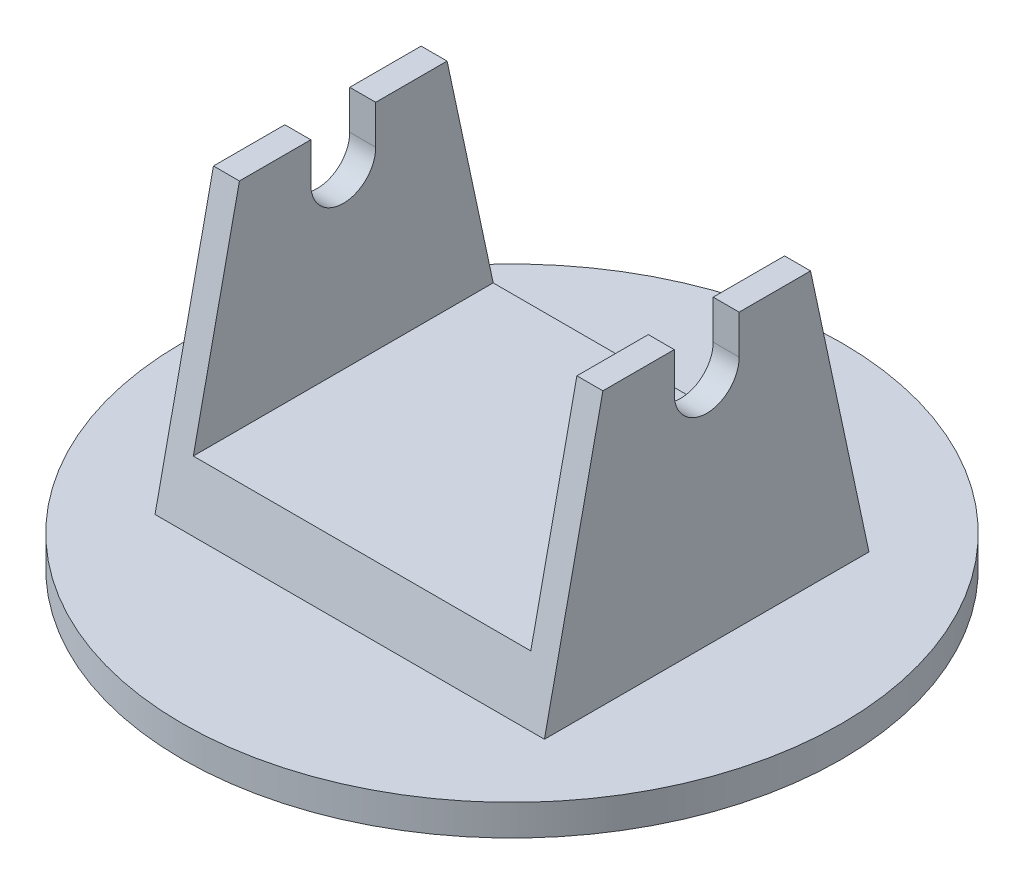
ISO-10303-21;
HEADER;
FILE_DESCRIPTION(('STEP AP214'),'2;1');
FILE_NAME('part.step','',(''),(''),'','','');
FILE_SCHEMA(('AUTOMOTIVE_DESIGN { 1 0 10303 214 1 1 1 1 }'));
ENDSEC;
DATA;
#1=APPLICATION_CONTEXT('core data for automotive mechanical design processes');
#2=APPLICATION_PROTOCOL_DEFINITION('international standard','automotive_design',2000,#1);
#3=PRODUCT_CONTEXT('',#1,'mechanical');
#4=PRODUCT('Part','Part','',(#3));
#5=PRODUCT_RELATED_PRODUCT_CATEGORY('part','',(#4));
#6=PRODUCT_DEFINITION_FORMATION('','',#4);
#7=PRODUCT_DEFINITION_CONTEXT('part definition',#1,'design');
#8=PRODUCT_DEFINITION('design','',#6,#7);
#9=PRODUCT_DEFINITION_SHAPE('','',#8);
#10=(LENGTH_UNIT() NAMED_UNIT(*) SI_UNIT(.MILLI.,.METRE.));
#11=(NAMED_UNIT(*) PLANE_ANGLE_UNIT() SI_UNIT($,.RADIAN.));
#12=(NAMED_UNIT(*) SI_UNIT($,.STERADIAN.) SOLID_ANGLE_UNIT());
#13=UNCERTAINTY_MEASURE_WITH_UNIT(LENGTH_MEASURE(1.E-05),#10,'distance_accuracy_value','');
#14=(GEOMETRIC_REPRESENTATION_CONTEXT(3) GLOBAL_UNCERTAINTY_ASSIGNED_CONTEXT((#13)) GLOBAL_UNIT_ASSIGNED_CONTEXT((#10,
#11,#12)) REPRESENTATION_CONTEXT('',''));
#15=CARTESIAN_POINT('',(0.,0.,0.));
#16=DIRECTION('',(0.,0.,1.));
#17=DIRECTION('',(1.,0.,0.));
#18=AXIS2_PLACEMENT_3D('',#15,#16,#17);
#19=CARTESIAN_POINT('',(30.,84.025,-16.));
#20=DIRECTION('',(0.,-1.,0.));
#21=DIRECTION('',(0.,0.,-1.));
#22=AXIS2_PLACEMENT_3D('',#19,#20,#21);
#23=PLANE('',#22);
#24=DIRECTION('',(1.,0.,0.));
#25=VECTOR('',#24,1.);
#26=CARTESIAN_POINT('',(-50.8,84.025,5.));
#27=LINE('',#26,#25);
#28=CARTESIAN_POINT('',(26.,84.025,5.));
#29=VERTEX_POINT('',#28);
#30=CARTESIAN_POINT('',(30.,84.025,5.));
#31=VERTEX_POINT('',#30);
#32=EDGE_CURVE('E280',#29,#31,#27,.T.);
#33=ORIENTED_EDGE('',*,*,#32,.F.);
#34=DIRECTION('',(0.,0.,1.));
#35=VECTOR('',#34,1.);
#36=CARTESIAN_POINT('',(26.,84.025,-50.8));
#37=LINE('',#36,#35);
#38=CARTESIAN_POINT('',(26.,84.025,16.));
#39=VERTEX_POINT('',#38);
#40=EDGE_CURVE('E292',#29,#39,#37,.T.);
#41=ORIENTED_EDGE('',*,*,#40,.T.);
#42=DIRECTION('',(-1.,0.,0.));
#43=VECTOR('',#42,1.);
#44=CARTESIAN_POINT('',(30.,84.025,16.));
#45=LINE('',#44,#43);
#46=CARTESIAN_POINT('',(30.,84.025,16.));
#47=VERTEX_POINT('',#46);
#48=EDGE_CURVE('E165',#47,#39,#45,.T.);
#49=ORIENTED_EDGE('',*,*,#48,.F.);
#50=DIRECTION('',(0.,0.,1.));
#51=VECTOR('',#50,1.);
#52=CARTESIAN_POINT('',(30.,84.025,-16.));
#53=LINE('',#52,#51);
#54=EDGE_CURVE('E229',#31,#47,#53,.T.);
#55=ORIENTED_EDGE('',*,*,#54,.F.);
#56=EDGE_LOOP('',(#33,#41,#49,#55));
#57=FACE_BOUND('',#56,.T.);
#58=ADVANCED_FACE('F32',(#57),#23,.F.);
#59=DIRECTION('',(-1.,0.,0.));
#60=VECTOR('',#59,1.);
#61=CARTESIAN_POINT('',(30.,84.025,-16.));
#62=LINE('',#61,#60);
#63=CARTESIAN_POINT('',(30.,84.025,-16.));
#64=VERTEX_POINT('',#63);
#65=CARTESIAN_POINT('',(26.,84.025,-16.));
#66=VERTEX_POINT('',#65);
#67=EDGE_CURVE('E164',#64,#66,#62,.T.);
#68=ORIENTED_EDGE('',*,*,#67,.T.);
#69=CARTESIAN_POINT('',(26.,84.025,-5.));
#70=VERTEX_POINT('',#69);
#71=EDGE_CURVE('E308',#66,#70,#37,.T.);
#72=ORIENTED_EDGE('',*,*,#71,.T.);
#73=DIRECTION('',(1.,0.,0.));
#74=VECTOR('',#73,1.);
#75=CARTESIAN_POINT('',(-50.8,84.025,-5.));
#76=LINE('',#75,#74);
#77=CARTESIAN_POINT('',(30.,84.025,-5.));
#78=VERTEX_POINT('',#77);
#79=EDGE_CURVE('E201',#70,#78,#76,.T.);
#80=ORIENTED_EDGE('',*,*,#79,.T.);
#81=EDGE_CURVE('E230',#64,#78,#53,.T.);
#82=ORIENTED_EDGE('',*,*,#81,.F.);
#83=EDGE_LOOP('',(#68,#72,#80,#82));
#84=FACE_BOUND('',#83,.T.);
#85=ADVANCED_FACE('F272',(#84),#23,.F.);
#86=CARTESIAN_POINT('',(-50.8,78.025,0.));
#87=DIRECTION('',(1.,0.,0.));
#88=DIRECTION('',(0.,0.,-1.));
#89=AXIS2_PLACEMENT_3D('',#86,#87,#88);
#90=CYLINDRICAL_SURFACE('',#89,5.);
#91=DIRECTION('',(1.,0.,0.));
#92=VECTOR('',#91,1.);
#93=CARTESIAN_POINT('',(-50.8,78.025,-5.));
#94=LINE('',#93,#92);
#95=CARTESIAN_POINT('',(26.,78.025,-5.));
#96=VERTEX_POINT('',#95);
#97=CARTESIAN_POINT('',(30.,78.025,-5.));
#98=VERTEX_POINT('',#97);
#99=EDGE_CURVE('E199',#96,#98,#94,.T.);
#100=ORIENTED_EDGE('',*,*,#99,.F.);
#101=CARTESIAN_POINT('',(26.,78.025,0.));
#102=DIRECTION('',(1.,0.,0.));
#103=DIRECTION('',(0.,0.,-1.));
#104=AXIS2_PLACEMENT_3D('',#101,#102,#103);
#105=CIRCLE('',#104,5.);
#106=CARTESIAN_POINT('',(26.,78.025,5.));
#107=VERTEX_POINT('',#106);
#108=EDGE_CURVE('E207',#96,#107,#105,.F.);
#109=ORIENTED_EDGE('',*,*,#108,.T.);
#110=DIRECTION('',(1.,0.,0.));
#111=VECTOR('',#110,1.);
#112=CARTESIAN_POINT('',(-50.8,78.025,5.));
#113=LINE('',#112,#111);
#114=CARTESIAN_POINT('',(30.,78.025,5.));
#115=VERTEX_POINT('',#114);
#116=EDGE_CURVE('E279',#107,#115,#113,.T.);
#117=ORIENTED_EDGE('',*,*,#116,.T.);
#118=CARTESIAN_POINT('',(30.,78.025,0.));
#119=DIRECTION('',(1.,0.,0.));
#120=DIRECTION('',(0.,0.,-1.));
#121=AXIS2_PLACEMENT_3D('',#118,#119,#120);
#122=CIRCLE('',#121,5.);
#123=EDGE_CURVE('E210',#115,#98,#122,.T.);
#124=ORIENTED_EDGE('',*,*,#123,.T.);
#125=EDGE_LOOP('',(#100,#109,#117,#124));
#126=FACE_BOUND('',#125,.T.);
#127=ADVANCED_FACE('F206',(#126),#90,.F.);
#128=CARTESIAN_POINT('',(-50.8,78.025,5.));
#129=DIRECTION('',(0.,0.,1.));
#130=DIRECTION('',(0.,-1.,0.));
#131=AXIS2_PLACEMENT_3D('',#128,#129,#130);
#132=PLANE('',#131);
#133=ORIENTED_EDGE('',*,*,#116,.F.);
#134=DIRECTION('',(0.,1.,0.));
#135=VECTOR('',#134,1.);
#136=CARTESIAN_POINT('',(26.,78.025,5.));
#137=LINE('',#136,#135);
#138=EDGE_CURVE('E287',#107,#29,#137,.T.);
#139=ORIENTED_EDGE('',*,*,#138,.T.);
#140=ORIENTED_EDGE('',*,*,#32,.T.);
#141=DIRECTION('',(0.,-1.,0.));
#142=VECTOR('',#141,1.);
#143=CARTESIAN_POINT('',(30.,78.025,5.));
#144=LINE('',#143,#142);
#145=EDGE_CURVE('E213',#31,#115,#144,.T.);
#146=ORIENTED_EDGE('',*,*,#145,.T.);
#147=EDGE_LOOP('',(#133,#139,#140,#146));
#148=FACE_BOUND('',#147,.T.);
#149=ADVANCED_FACE('F286',(#148),#132,.F.);
#150=CARTESIAN_POINT('',(-50.8,78.025,-5.));
#151=DIRECTION('',(0.,0.,-1.));
#152=DIRECTION('',(0.,1.,0.));
#153=AXIS2_PLACEMENT_3D('',#150,#151,#152);
#154=PLANE('',#153);
#155=ORIENTED_EDGE('',*,*,#79,.F.);
#156=DIRECTION('',(0.,-1.,0.));
#157=VECTOR('',#156,1.);
#158=CARTESIAN_POINT('',(26.,78.025,-5.));
#159=LINE('',#158,#157);
#160=EDGE_CURVE('E40',#70,#96,#159,.T.);
#161=ORIENTED_EDGE('',*,*,#160,.T.);
#162=ORIENTED_EDGE('',*,*,#99,.T.);
#163=DIRECTION('',(0.,1.,0.));
#164=VECTOR('',#163,1.);
#165=CARTESIAN_POINT('',(30.,78.025,-5.));
#166=LINE('',#165,#164);
#167=EDGE_CURVE('E217',#98,#78,#166,.T.);
#168=ORIENTED_EDGE('',*,*,#167,.T.);
#169=EDGE_LOOP('',(#155,#161,#162,#168));
#170=FACE_BOUND('',#169,.T.);
#171=ADVANCED_FACE('F197',(#170),#154,.F.);
#172=CARTESIAN_POINT('',(-26.,84.025,16.));
#173=VERTEX_POINT('',#172);
#174=CARTESIAN_POINT('',(-30.,84.025,16.));
#175=VERTEX_POINT('',#174);
#176=EDGE_CURVE('E170',#173,#175,#45,.T.);
#177=ORIENTED_EDGE('',*,*,#176,.F.);
#178=DIRECTION('',(0.,0.,1.));
#179=VECTOR('',#178,1.);
#180=CARTESIAN_POINT('',(-26.,84.025,-50.8));
#181=LINE('',#180,#179);
#182=CARTESIAN_POINT('',(-26.,84.025,5.));
#183=VERTEX_POINT('',#182);
#184=EDGE_CURVE('E158',#183,#173,#181,.T.);
#185=ORIENTED_EDGE('',*,*,#184,.F.);
#186=CARTESIAN_POINT('',(-30.,84.025,5.));
#187=VERTEX_POINT('',#186);
#188=EDGE_CURVE('E250',#187,#183,#27,.T.);
#189=ORIENTED_EDGE('',*,*,#188,.F.);
#190=DIRECTION('',(0.,0.,1.));
#191=VECTOR('',#190,1.);
#192=CARTESIAN_POINT('',(-30.,84.025,-16.));
#193=LINE('',#192,#191);
#194=EDGE_CURVE('E240',#187,#175,#193,.T.);
#195=ORIENTED_EDGE('',*,*,#194,.T.);
#196=EDGE_LOOP('',(#177,#185,#189,#195));
#197=FACE_BOUND('',#196,.T.);
#198=ADVANCED_FACE('F247',(#197),#23,.F.);
#199=CARTESIAN_POINT('',(0.,42.025,0.));
#200=DIRECTION('',(0.,-1.,0.));
#201=DIRECTION('',(0.,0.,-1.));
#202=AXIS2_PLACEMENT_3D('',#199,#200,#201);
#203=CYLINDRICAL_SURFACE('',#202,50.8);
#204=CARTESIAN_POINT('',(0.,42.025,0.));
#205=DIRECTION('',(0.,1.,0.));
#206=DIRECTION('',(0.,0.,1.));
#207=AXIS2_PLACEMENT_3D('',#204,#205,#206);
#208=CIRCLE('',#207,50.8);
#209=CARTESIAN_POINT('',(0.,42.025,-50.8));
#210=VERTEX_POINT('',#209);
#211=EDGE_CURVE('E179',#210,#210,#208,.T.);
#212=CARTESIAN_POINT('',(0.,37.2625,0.));
#213=DIRECTION('',(0.,1.,0.));
#214=DIRECTION('',(0.,0.,1.));
#215=AXIS2_PLACEMENT_3D('',#212,#213,#214);
#216=CIRCLE('',#215,50.8);
#217=CARTESIAN_POINT('',(0.,37.2625,-50.8));
#218=VERTEX_POINT('',#217);
#219=EDGE_CURVE('E178',#218,#218,#216,.T.);
#220=CARTESIAN_POINT('',(0.,42.025,-50.8));
#221=CARTESIAN_POINT('',(0.,41.975390625,-50.8));
#222=CARTESIAN_POINT('',(0.,41.92578125,-50.8));
#223=CARTESIAN_POINT('',(0.,41.8265625,-50.8));
#224=CARTESIAN_POINT('',(0.,41.776953125,-50.8));
#225=CARTESIAN_POINT('',(0.,41.677734375,-50.8));
#226=CARTESIAN_POINT('',(0.,41.628125,-50.8));
#227=CARTESIAN_POINT('',(0.,41.52890625,-50.8));
#228=CARTESIAN_POINT('',(0.,41.479296875,-50.8));
#229=CARTESIAN_POINT('',(0.,41.380078125,-50.8));
#230=CARTESIAN_POINT('',(0.,41.33046875,-50.8));
#231=CARTESIAN_POINT('',(0.,41.23125,-50.8));
#232=CARTESIAN_POINT('',(0.,41.181640625,-50.8));
#233=CARTESIAN_POINT('',(0.,41.082421875,-50.8));
#234=CARTESIAN_POINT('',(0.,41.0328125,-50.8));
#235=CARTESIAN_POINT('',(0.,40.93359375,-50.8));
#236=CARTESIAN_POINT('',(0.,40.883984375,-50.8));
#237=CARTESIAN_POINT('',(0.,40.784765625,-50.8));
#238=CARTESIAN_POINT('',(0.,40.73515625,-50.8));
#239=CARTESIAN_POINT('',(0.,40.6359375,-50.8));
#240=CARTESIAN_POINT('',(0.,40.586328125,-50.8));
#241=CARTESIAN_POINT('',(0.,40.487109375,-50.8));
#242=CARTESIAN_POINT('',(0.,40.4375,-50.8));
#243=CARTESIAN_POINT('',(0.,40.33828125,-50.8));
#244=CARTESIAN_POINT('',(0.,40.288671875,-50.8));
#245=CARTESIAN_POINT('',(0.,40.189453125,-50.8));
#246=CARTESIAN_POINT('',(0.,40.13984375,-50.8));
#247=CARTESIAN_POINT('',(0.,40.040625,-50.8));
#248=CARTESIAN_POINT('',(0.,39.991015625,-50.8));
#249=CARTESIAN_POINT('',(0.,39.891796875,-50.8));
#250=CARTESIAN_POINT('',(0.,39.8421875,-50.8));
#251=CARTESIAN_POINT('',(0.,39.74296875,-50.8));
#252=CARTESIAN_POINT('',(0.,39.693359375,-50.8));
#253=CARTESIAN_POINT('',(0.,39.594140625,-50.8));
#254=CARTESIAN_POINT('',(0.,39.54453125,-50.8));
#255=CARTESIAN_POINT('',(0.,39.4453125,-50.8));
#256=CARTESIAN_POINT('',(0.,39.395703125,-50.8));
#257=CARTESIAN_POINT('',(0.,39.296484375,-50.8));
#258=CARTESIAN_POINT('',(0.,39.246875,-50.8));
#259=CARTESIAN_POINT('',(0.,39.14765625,-50.8));
#260=CARTESIAN_POINT('',(0.,39.098046875,-50.8));
#261=CARTESIAN_POINT('',(0.,38.998828125,-50.8));
#262=CARTESIAN_POINT('',(0.,38.94921875,-50.8));
#263=CARTESIAN_POINT('',(0.,38.85,-50.8));
#264=CARTESIAN_POINT('',(0.,38.800390625,-50.8));
#265=CARTESIAN_POINT('',(0.,38.701171875,-50.8));
#266=CARTESIAN_POINT('',(0.,38.6515625,-50.8));
#267=CARTESIAN_POINT('',(0.,38.55234375,-50.8));
#268=CARTESIAN_POINT('',(0.,38.502734375,-50.8));
#269=CARTESIAN_POINT('',(0.,38.403515625,-50.8));
#270=CARTESIAN_POINT('',(0.,38.35390625,-50.8));
#271=CARTESIAN_POINT('',(0.,38.2546875,-50.8));
#272=CARTESIAN_POINT('',(0.,38.205078125,-50.8));
#273=CARTESIAN_POINT('',(0.,38.105859375,-50.8));
#274=CARTESIAN_POINT('',(0.,38.05625,-50.8));
#275=CARTESIAN_POINT('',(0.,37.95703125,-50.8));
#276=CARTESIAN_POINT('',(0.,37.907421875,-50.8));
#277=CARTESIAN_POINT('',(0.,37.808203125,-50.8));
#278=CARTESIAN_POINT('',(0.,37.75859375,-50.8));
#279=CARTESIAN_POINT('',(0.,37.659375,-50.8));
#280=CARTESIAN_POINT('',(0.,37.609765625,-50.8));
#281=CARTESIAN_POINT('',(0.,37.510546875,-50.8));
#282=CARTESIAN_POINT('',(0.,37.4609375,-50.8));
#283=CARTESIAN_POINT('',(0.,37.36171875,-50.8));
#284=CARTESIAN_POINT('',(0.,37.312109375,-50.8));
#285=CARTESIAN_POINT('',(0.,37.2625,-50.8));
#286=B_SPLINE_CURVE_WITH_KNOTS('',3,(#220,#221,#222,#223,#224,#225,#226,#227,#228,#229,#230,
#231,#232,#233,#234,#235,#236,#237,#238,#239,#240,#241,#242,#243,#244,#245,#246,#247,#248,#249,
#250,#251,#252,#253,#254,#255,#256,#257,#258,#259,#260,#261,#262,#263,#264,#265,#266,#267,#268,
#269,#270,#271,#272,#273,#274,#275,#276,#277,#278,#279,#280,#281,#282,#283,#284,#285),
.UNSPECIFIED.,.F.,.F.,(4,2,2,2,2,2,2,2,2,2,2,2,2,2,2,2,2,2,2,2,2,2,2,2,2,2,2,2,2,2,2,2,4),(0.,
0.148828125,0.29765625,0.446484375,0.5953125,0.744140625,0.892968750000001,1.041796875,1.190625,
1.339453125,1.48828125,1.637109375,1.7859375,1.934765625,2.08359375,2.232421875,2.38125,
2.530078125,2.67890625,2.827734375,2.9765625,3.125390625,3.27421875,3.423046875,3.571875,
3.720703125,3.86953125,4.018359375,4.1671875,4.316015625,4.46484375,4.613671875,4.7625),.UNSPECIFIED.);
#287=EDGE_CURVE('BSEAM34',#210,#218,#286,.T.);
#288=ORIENTED_EDGE('',*,*,#211,.F.);
#289=ORIENTED_EDGE('',*,*,#219,.T.);
#290=ORIENTED_EDGE('',*,*,#287,.T.);
#291=ORIENTED_EDGE('',*,*,#287,.F.);
#292=EDGE_LOOP('',(#288,#290,#289,#291));
#293=FACE_BOUND('',#292,.T.);
#294=ADVANCED_FACE('F34',(#293),#203,.T.);
#295=CARTESIAN_POINT('',(0.,42.025,0.));
#296=DIRECTION('',(0.,1.,0.));
#297=DIRECTION('',(0.,0.,1.));
#298=AXIS2_PLACEMENT_3D('',#295,#296,#297);
#299=PLANE('',#298);
#300=DIRECTION('',(0.,0.,-1.));
#301=VECTOR('',#300,1.);
#302=CARTESIAN_POINT('',(30.,42.025,25.));
#303=LINE('',#302,#301);
#304=CARTESIAN_POINT('',(30.,42.025,25.));
#305=VERTEX_POINT('',#304);
#306=CARTESIAN_POINT('',(30.,42.025,-25.));
#307=VERTEX_POINT('',#306);
#308=EDGE_CURVE('E224',#305,#307,#303,.T.);
#309=ORIENTED_EDGE('',*,*,#308,.F.);
#310=DIRECTION('',(-1.,0.,0.));
#311=VECTOR('',#310,1.);
#312=CARTESIAN_POINT('',(30.,42.025,25.));
#313=LINE('',#312,#311);
#314=CARTESIAN_POINT('',(-30.,42.025,25.));
#315=VERTEX_POINT('',#314);
#316=EDGE_CURVE('E175',#305,#315,#313,.T.);
#317=ORIENTED_EDGE('',*,*,#316,.T.);
#318=DIRECTION('',(0.,0.,-1.));
#319=VECTOR('',#318,1.);
#320=CARTESIAN_POINT('',(-30.,42.025,25.));
#321=LINE('',#320,#319);
#322=CARTESIAN_POINT('',(-30.,42.025,-25.));
#323=VERTEX_POINT('',#322);
#324=EDGE_CURVE('E236',#315,#323,#321,.T.);
#325=ORIENTED_EDGE('',*,*,#324,.T.);
#326=DIRECTION('',(-1.,0.,0.));
#327=VECTOR('',#326,1.);
#328=CARTESIAN_POINT('',(30.,42.025,-25.));
#329=LINE('',#328,#327);
#330=EDGE_CURVE('E168',#307,#323,#329,.T.);
#331=ORIENTED_EDGE('',*,*,#330,.F.);
#332=EDGE_LOOP('',(#309,#317,#325,#331));
#333=FACE_BOUND('',#332,.T.);
#334=ORIENTED_EDGE('',*,*,#211,.T.);
#335=EDGE_LOOP('',(#334));
#336=FACE_BOUND('',#335,.T.);
#337=ADVANCED_FACE('F260',(#333,#336),#299,.T.);
#338=CARTESIAN_POINT('',(0.,37.2625,0.));
#339=DIRECTION('',(0.,1.,0.));
#340=DIRECTION('',(0.,0.,1.));
#341=AXIS2_PLACEMENT_3D('',#338,#339,#340);
#342=PLANE('',#341);
#343=ORIENTED_EDGE('',*,*,#219,.F.);
#344=EDGE_LOOP('',(#343));
#345=FACE_BOUND('',#344,.T.);
#346=ADVANCED_FACE('F425',(#345),#342,.F.);
#347=CARTESIAN_POINT('',(30.,84.025,16.));
#348=DIRECTION('',(0.,-0.209529088730873,-0.97780241407741));
#349=DIRECTION('',(0.,0.97780241407741,-0.209529088730873));
#350=AXIS2_PLACEMENT_3D('',#347,#348,#349);
#351=PLANE('',#350);
#352=ORIENTED_EDGE('',*,*,#48,.T.);
#353=DIRECTION('',(0.,-0.97780241407741,0.209529088730873));
#354=VECTOR('',#353,1.);
#355=CARTESIAN_POINT('',(26.,84.025,16.));
#356=LINE('',#355,#354);
#357=CARTESIAN_POINT('',(26.,50.8713,23.1043642857143));
#358=VERTEX_POINT('',#357);
#359=EDGE_CURVE('E295',#39,#358,#356,.T.);
#360=ORIENTED_EDGE('',*,*,#359,.T.);
#361=DIRECTION('',(-1.,0.,0.));
#362=VECTOR('',#361,1.);
#363=CARTESIAN_POINT('',(30.,50.8713,23.1043642857143));
#364=LINE('',#363,#362);
#365=CARTESIAN_POINT('',(-26.,50.8713,23.1043642857143));
#366=VERTEX_POINT('',#365);
#367=EDGE_CURVE('E274',#358,#366,#364,.T.);
#368=ORIENTED_EDGE('',*,*,#367,.T.);
#369=DIRECTION('',(0.,0.97780241407741,-0.209529088730873));
#370=VECTOR('',#369,1.);
#371=CARTESIAN_POINT('',(-26.,84.025,16.));
#372=LINE('',#371,#370);
#373=EDGE_CURVE('E150',#366,#173,#372,.T.);
#374=ORIENTED_EDGE('',*,*,#373,.T.);
#375=ORIENTED_EDGE('',*,*,#176,.T.);
#376=DIRECTION('',(0.,-0.97780241407741,0.209529088730873));
#377=VECTOR('',#376,1.);
#378=CARTESIAN_POINT('',(-30.,84.025,16.));
#379=LINE('',#378,#377);
#380=EDGE_CURVE('E233',#175,#315,#379,.T.);
#381=ORIENTED_EDGE('',*,*,#380,.T.);
#382=ORIENTED_EDGE('',*,*,#316,.F.);
#383=DIRECTION('',(0.,-0.97780241407741,0.209529088730873));
#384=VECTOR('',#383,1.);
#385=CARTESIAN_POINT('',(30.,84.025,16.));
#386=LINE('',#385,#384);
#387=EDGE_CURVE('E222',#47,#305,#386,.T.);
#388=ORIENTED_EDGE('',*,*,#387,.F.);
#389=EDGE_LOOP('',(#352,#360,#368,#374,#375,#381,#382,#388));
#390=FACE_BOUND('',#389,.T.);
#391=ADVANCED_FACE('F255',(#390),#351,.F.);
#392=CARTESIAN_POINT('',(30.,42.025,-25.));
#393=DIRECTION('',(0.,-0.209529088730873,0.97780241407741));
#394=DIRECTION('',(0.,-0.97780241407741,-0.209529088730873));
#395=AXIS2_PLACEMENT_3D('',#392,#393,#394);
#396=PLANE('',#395);
#397=DIRECTION('',(1.,0.,0.));
#398=VECTOR('',#397,1.);
#399=CARTESIAN_POINT('',(30.,50.8713,-23.1043642857143));
#400=LINE('',#399,#398);
#401=CARTESIAN_POINT('',(-26.,50.8713,-23.1043642857143));
#402=VERTEX_POINT('',#401);
#403=CARTESIAN_POINT('',(26.,50.8713,-23.1043642857143));
#404=VERTEX_POINT('',#403);
#405=EDGE_CURVE('E11',#402,#404,#400,.T.);
#406=ORIENTED_EDGE('',*,*,#405,.T.);
#407=DIRECTION('',(0.,0.97780241407741,0.209529088730873));
#408=VECTOR('',#407,1.);
#409=CARTESIAN_POINT('',(26.,42.025,-25.));
#410=LINE('',#409,#408);
#411=EDGE_CURVE('E270',#404,#66,#410,.T.);
#412=ORIENTED_EDGE('',*,*,#411,.T.);
#413=ORIENTED_EDGE('',*,*,#67,.F.);
#414=DIRECTION('',(0.,0.97780241407741,0.209529088730873));
#415=VECTOR('',#414,1.);
#416=CARTESIAN_POINT('',(30.,42.025,-25.));
#417=LINE('',#416,#415);
#418=EDGE_CURVE('E227',#307,#64,#417,.T.);
#419=ORIENTED_EDGE('',*,*,#418,.F.);
#420=ORIENTED_EDGE('',*,*,#330,.T.);
#421=DIRECTION('',(0.,0.97780241407741,0.209529088730873));
#422=VECTOR('',#421,1.);
#423=CARTESIAN_POINT('',(-30.,42.025,-25.));
#424=LINE('',#423,#422);
#425=CARTESIAN_POINT('',(-30.,84.025,-16.));
#426=VERTEX_POINT('',#425);
#427=EDGE_CURVE('E162',#323,#426,#424,.T.);
#428=ORIENTED_EDGE('',*,*,#427,.T.);
#429=CARTESIAN_POINT('',(-26.,84.025,-16.));
#430=VERTEX_POINT('',#429);
#431=EDGE_CURVE('E156',#430,#426,#62,.T.);
#432=ORIENTED_EDGE('',*,*,#431,.F.);
#433=DIRECTION('',(0.,-0.97780241407741,-0.209529088730873));
#434=VECTOR('',#433,1.);
#435=CARTESIAN_POINT('',(-26.,42.025,-25.));
#436=LINE('',#435,#434);
#437=EDGE_CURVE('E144',#430,#402,#436,.T.);
#438=ORIENTED_EDGE('',*,*,#437,.T.);
#439=EDGE_LOOP('',(#406,#412,#413,#419,#420,#428,#432,#438));
#440=FACE_BOUND('',#439,.T.);
#441=ADVANCED_FACE('F160',(#440),#396,.F.);
#442=CARTESIAN_POINT('',(-30.,84.025,-5.));
#443=VERTEX_POINT('',#442);
#444=CARTESIAN_POINT('',(-26.,84.025,-5.));
#445=VERTEX_POINT('',#444);
#446=EDGE_CURVE('E54',#443,#445,#76,.T.);
#447=ORIENTED_EDGE('',*,*,#446,.T.);
#448=EDGE_CURVE('E47',#430,#445,#181,.T.);
#449=ORIENTED_EDGE('',*,*,#448,.F.);
#450=ORIENTED_EDGE('',*,*,#431,.T.);
#451=EDGE_CURVE('E225',#426,#443,#193,.T.);
#452=ORIENTED_EDGE('',*,*,#451,.T.);
#453=EDGE_LOOP('',(#447,#449,#450,#452));
#454=FACE_BOUND('',#453,.T.);
#455=ADVANCED_FACE('F154',(#454),#23,.F.);
#456=CARTESIAN_POINT('',(30.,42.025,25.));
#457=DIRECTION('',(1.,0.,0.));
#458=DIRECTION('',(0.,0.,-1.));
#459=AXIS2_PLACEMENT_3D('',#456,#457,#458);
#460=PLANE('',#459);
#461=ORIENTED_EDGE('',*,*,#145,.F.);
#462=ORIENTED_EDGE('',*,*,#54,.T.);
#463=ORIENTED_EDGE('',*,*,#387,.T.);
#464=ORIENTED_EDGE('',*,*,#308,.T.);
#465=ORIENTED_EDGE('',*,*,#418,.T.);
#466=ORIENTED_EDGE('',*,*,#81,.T.);
#467=ORIENTED_EDGE('',*,*,#167,.F.);
#468=ORIENTED_EDGE('',*,*,#123,.F.);
#469=EDGE_LOOP('',(#461,#462,#463,#464,#465,#466,#467,#468));
#470=FACE_BOUND('',#469,.T.);
#471=ADVANCED_FACE('F266',(#470),#460,.T.);
#472=CARTESIAN_POINT('',(-30.,42.025,25.));
#473=DIRECTION('',(1.,0.,0.));
#474=DIRECTION('',(0.,0.,-1.));
#475=AXIS2_PLACEMENT_3D('',#472,#473,#474);
#476=PLANE('',#475);
#477=ORIENTED_EDGE('',*,*,#194,.F.);
#478=DIRECTION('',(0.,-1.,0.));
#479=VECTOR('',#478,1.);
#480=CARTESIAN_POINT('',(-30.,42.025,5.));
#481=LINE('',#480,#479);
#482=CARTESIAN_POINT('',(-30.,78.025,5.));
#483=VERTEX_POINT('',#482);
#484=EDGE_CURVE('E189',#187,#483,#481,.T.);
#485=ORIENTED_EDGE('',*,*,#484,.T.);
#486=CARTESIAN_POINT('',(-30.,78.025,0.));
#487=DIRECTION('',(1.,0.,0.));
#488=DIRECTION('',(0.,0.,-1.));
#489=AXIS2_PLACEMENT_3D('',#486,#487,#488);
#490=CIRCLE('',#489,5.);
#491=CARTESIAN_POINT('',(-30.,78.025,-5.));
#492=VERTEX_POINT('',#491);
#493=EDGE_CURVE('E186',#483,#492,#490,.T.);
#494=ORIENTED_EDGE('',*,*,#493,.T.);
#495=DIRECTION('',(0.,1.,0.));
#496=VECTOR('',#495,1.);
#497=CARTESIAN_POINT('',(-30.,42.025,-5.));
#498=LINE('',#497,#496);
#499=EDGE_CURVE('E182',#492,#443,#498,.T.);
#500=ORIENTED_EDGE('',*,*,#499,.T.);
#501=ORIENTED_EDGE('',*,*,#451,.F.);
#502=ORIENTED_EDGE('',*,*,#427,.F.);
#503=ORIENTED_EDGE('',*,*,#324,.F.);
#504=ORIENTED_EDGE('',*,*,#380,.F.);
#505=EDGE_LOOP('',(#477,#485,#494,#500,#501,#502,#503,#504));
#506=FACE_BOUND('',#505,.T.);
#507=ADVANCED_FACE('F252',(#506),#476,.F.);
#508=CARTESIAN_POINT('',(-26.,78.025,5.));
#509=VERTEX_POINT('',#508);
#510=EDGE_CURVE('E237',#483,#509,#113,.T.);
#511=ORIENTED_EDGE('',*,*,#510,.T.);
#512=CARTESIAN_POINT('',(-26.,78.025,0.));
#513=DIRECTION('',(-1.,0.,0.));
#514=DIRECTION('',(0.,0.,1.));
#515=AXIS2_PLACEMENT_3D('',#512,#513,#514);
#516=CIRCLE('',#515,5.);
#517=CARTESIAN_POINT('',(-26.,78.025,-5.));
#518=VERTEX_POINT('',#517);
#519=EDGE_CURVE('E304',#509,#518,#516,.F.);
#520=ORIENTED_EDGE('',*,*,#519,.T.);
#521=EDGE_CURVE('E212',#492,#518,#94,.T.);
#522=ORIENTED_EDGE('',*,*,#521,.F.);
#523=ORIENTED_EDGE('',*,*,#493,.F.);
#524=EDGE_LOOP('',(#511,#520,#522,#523));
#525=FACE_BOUND('',#524,.T.);
#526=ADVANCED_FACE('F350',(#525),#90,.F.);
#527=ORIENTED_EDGE('',*,*,#188,.T.);
#528=DIRECTION('',(0.,-1.,0.));
#529=VECTOR('',#528,1.);
#530=CARTESIAN_POINT('',(-26.,78.025,5.));
#531=LINE('',#530,#529);
#532=EDGE_CURVE('E151',#183,#509,#531,.T.);
#533=ORIENTED_EDGE('',*,*,#532,.T.);
#534=ORIENTED_EDGE('',*,*,#510,.F.);
#535=ORIENTED_EDGE('',*,*,#484,.F.);
#536=EDGE_LOOP('',(#527,#533,#534,#535));
#537=FACE_BOUND('',#536,.T.);
#538=ADVANCED_FACE('F323',(#537),#132,.F.);
#539=ORIENTED_EDGE('',*,*,#521,.T.);
#540=DIRECTION('',(0.,1.,0.));
#541=VECTOR('',#540,1.);
#542=CARTESIAN_POINT('',(-26.,78.025,-5.));
#543=LINE('',#542,#541);
#544=EDGE_CURVE('E192',#518,#445,#543,.T.);
#545=ORIENTED_EDGE('',*,*,#544,.T.);
#546=ORIENTED_EDGE('',*,*,#446,.F.);
#547=ORIENTED_EDGE('',*,*,#499,.F.);
#548=EDGE_LOOP('',(#539,#545,#546,#547));
#549=FACE_BOUND('',#548,.T.);
#550=ADVANCED_FACE('F316',(#549),#154,.F.);
#551=CARTESIAN_POINT('',(-26.,50.8713,-50.8));
#552=DIRECTION('',(0.,-1.,0.));
#553=DIRECTION('',(0.,0.,-1.));
#554=AXIS2_PLACEMENT_3D('',#551,#552,#553);
#555=PLANE('',#554);
#556=DIRECTION('',(0.,0.,1.));
#557=VECTOR('',#556,1.);
#558=CARTESIAN_POINT('',(26.,50.8713,-50.8));
#559=LINE('',#558,#557);
#560=EDGE_CURVE('E307',#404,#358,#559,.T.);
#561=ORIENTED_EDGE('',*,*,#560,.F.);
#562=ORIENTED_EDGE('',*,*,#405,.F.);
#563=DIRECTION('',(0.,0.,1.));
#564=VECTOR('',#563,1.);
#565=CARTESIAN_POINT('',(-26.,50.8713,-50.8));
#566=LINE('',#565,#564);
#567=EDGE_CURVE('E147',#402,#366,#566,.T.);
#568=ORIENTED_EDGE('',*,*,#567,.T.);
#569=ORIENTED_EDGE('',*,*,#367,.F.);
#570=EDGE_LOOP('',(#561,#562,#568,#569));
#571=FACE_BOUND('',#570,.T.);
#572=ADVANCED_FACE('F314',(#571),#555,.F.);
#573=CARTESIAN_POINT('',(26.,50.8713,-50.8));
#574=DIRECTION('',(1.,0.,0.));
#575=DIRECTION('',(0.,0.,-1.));
#576=AXIS2_PLACEMENT_3D('',#573,#574,#575);
#577=PLANE('',#576);
#578=ORIENTED_EDGE('',*,*,#40,.F.);
#579=ORIENTED_EDGE('',*,*,#138,.F.);
#580=ORIENTED_EDGE('',*,*,#108,.F.);
#581=ORIENTED_EDGE('',*,*,#160,.F.);
#582=ORIENTED_EDGE('',*,*,#71,.F.);
#583=ORIENTED_EDGE('',*,*,#411,.F.);
#584=ORIENTED_EDGE('',*,*,#560,.T.);
#585=ORIENTED_EDGE('',*,*,#359,.F.);
#586=EDGE_LOOP('',(#578,#579,#580,#581,#582,#583,#584,#585));
#587=FACE_BOUND('',#586,.T.);
#588=ADVANCED_FACE('F312',(#587),#577,.F.);
#589=CARTESIAN_POINT('',(-26.,50.8713,-50.8));
#590=DIRECTION('',(-1.,0.,0.));
#591=DIRECTION('',(0.,0.,1.));
#592=AXIS2_PLACEMENT_3D('',#589,#590,#591);
#593=PLANE('',#592);
#594=ORIENTED_EDGE('',*,*,#567,.F.);
#595=ORIENTED_EDGE('',*,*,#437,.F.);
#596=ORIENTED_EDGE('',*,*,#448,.T.);
#597=ORIENTED_EDGE('',*,*,#544,.F.);
#598=ORIENTED_EDGE('',*,*,#519,.F.);
#599=ORIENTED_EDGE('',*,*,#532,.F.);
#600=ORIENTED_EDGE('',*,*,#184,.T.);
#601=ORIENTED_EDGE('',*,*,#373,.F.);
#602=EDGE_LOOP('',(#594,#595,#596,#597,#598,#599,#600,#601));
#603=FACE_BOUND('',#602,.T.);
#604=ADVANCED_FACE('F145',(#603),#593,.F.);
#605=CLOSED_SHELL('',(#58,#85,#127,#149,#171,#198,#294,#337,#346,#391,#441,#455,#471,#507,#526,
#538,#550,#572,#588,#604));
#606=MANIFOLD_SOLID_BREP('B2',#605);
#607=ADVANCED_BREP_SHAPE_REPRESENTATION('',(#18,#606),#14);
#608=SHAPE_DEFINITION_REPRESENTATION(#9,#607);
ENDSEC;
END-ISO-10303-21;
